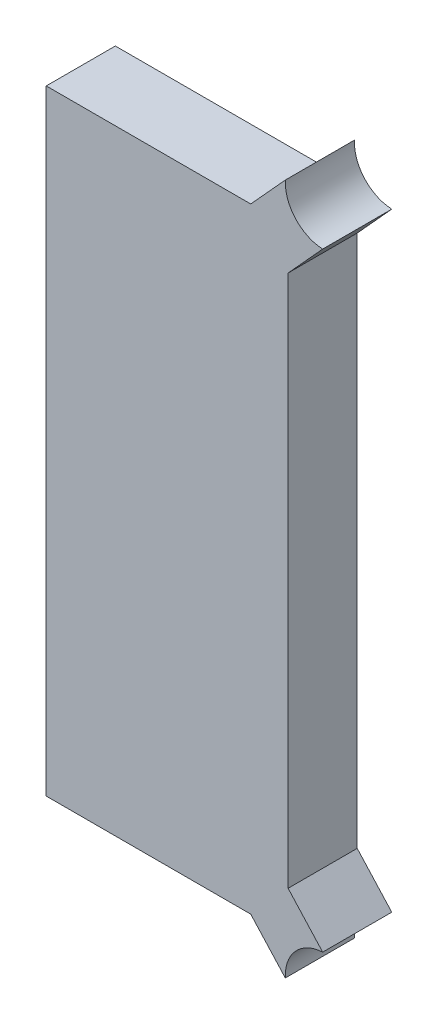
ISO-10303-21;
HEADER;
FILE_DESCRIPTION(('STEP AP214'),'2;1');
FILE_NAME('part.step','',(''),(''),'','','');
FILE_SCHEMA(('AUTOMOTIVE_DESIGN { 1 0 10303 214 1 1 1 1 }'));
ENDSEC;
DATA;
#1=APPLICATION_CONTEXT('core data for automotive mechanical design processes');
#2=APPLICATION_PROTOCOL_DEFINITION('international standard','automotive_design',2000,#1);
#3=PRODUCT_CONTEXT('',#1,'mechanical');
#4=PRODUCT('Part','Part','',(#3));
#5=PRODUCT_RELATED_PRODUCT_CATEGORY('part','',(#4));
#6=PRODUCT_DEFINITION_FORMATION('','',#4);
#7=PRODUCT_DEFINITION_CONTEXT('part definition',#1,'design');
#8=PRODUCT_DEFINITION('design','',#6,#7);
#9=PRODUCT_DEFINITION_SHAPE('','',#8);
#10=(LENGTH_UNIT() NAMED_UNIT(*) SI_UNIT(.MILLI.,.METRE.));
#11=(NAMED_UNIT(*) PLANE_ANGLE_UNIT() SI_UNIT($,.RADIAN.));
#12=(NAMED_UNIT(*) SI_UNIT($,.STERADIAN.) SOLID_ANGLE_UNIT());
#13=UNCERTAINTY_MEASURE_WITH_UNIT(LENGTH_MEASURE(1.E-05),#10,'distance_accuracy_value','');
#14=(GEOMETRIC_REPRESENTATION_CONTEXT(3) GLOBAL_UNCERTAINTY_ASSIGNED_CONTEXT((#13)) GLOBAL_UNIT_ASSIGNED_CONTEXT((#10,
#11,#12)) REPRESENTATION_CONTEXT('',''));
#15=CARTESIAN_POINT('',(0.,0.,0.));
#16=DIRECTION('',(0.,0.,1.));
#17=DIRECTION('',(1.,0.,0.));
#18=AXIS2_PLACEMENT_3D('',#15,#16,#17);
#19=CARTESIAN_POINT('',(0.495941568191569,-0.445,0.));
#20=DIRECTION('',(-0.739940073395943,-0.672672793996313,0.));
#21=DIRECTION('',(0.672672793996313,-0.739940073395943,0.));
#22=AXIS2_PLACEMENT_3D('',#19,#20,#21);
#23=PLANE('',#22);
#24=DIRECTION('',(0.672672793996313,-0.739940073395943,0.));
#25=VECTOR('',#24,1.);
#26=CARTESIAN_POINT('',(0.470402397064162,-0.416906911759853,0.));
#27=LINE('',#26,#25);
#28=CARTESIAN_POINT('',(0.495941568191569,-0.445,0.));
#29=VERTEX_POINT('',#28);
#30=CARTESIAN_POINT('',(0.545941568191569,-0.5,0.));
#31=VERTEX_POINT('',#30);
#32=EDGE_CURVE('E11',#29,#31,#27,.T.);
#33=ORIENTED_EDGE('',*,*,#32,.T.);
#34=DIRECTION('',(0.,0.,1.));
#35=VECTOR('',#34,1.);
#36=CARTESIAN_POINT('',(0.545941568191569,-0.5,0.));
#37=LINE('',#36,#35);
#38=CARTESIAN_POINT('',(0.545941568191569,-0.5,0.1));
#39=VERTEX_POINT('',#38);
#40=EDGE_CURVE('E24',#31,#39,#37,.T.);
#41=ORIENTED_EDGE('',*,*,#40,.T.);
#42=DIRECTION('',(0.672672793996313,-0.739940073395943,0.));
#43=VECTOR('',#42,1.);
#44=CARTESIAN_POINT('',(0.470402397064162,-0.416906911759853,0.1));
#45=LINE('',#44,#43);
#46=CARTESIAN_POINT('',(0.495941568191569,-0.445,0.1));
#47=VERTEX_POINT('',#46);
#48=EDGE_CURVE('E112',#47,#39,#45,.T.);
#49=ORIENTED_EDGE('',*,*,#48,.F.);
#50=DIRECTION('',(0.,0.,1.));
#51=VECTOR('',#50,1.);
#52=CARTESIAN_POINT('',(0.495941568191569,-0.445,0.));
#53=LINE('',#52,#51);
#54=EDGE_CURVE('E175',#29,#47,#53,.T.);
#55=ORIENTED_EDGE('',*,*,#54,.F.);
#56=EDGE_LOOP('',(#33,#41,#49,#55));
#57=FACE_BOUND('',#56,.T.);
#58=ADVANCED_FACE('F17',(#57),#23,.T.);
#59=CARTESIAN_POINT('',(0.2,-0.445,0.));
#60=DIRECTION('',(0.,-1.,0.));
#61=DIRECTION('',(1.,0.,0.));
#62=AXIS2_PLACEMENT_3D('',#59,#60,#61);
#63=PLANE('',#62);
#64=DIRECTION('',(1.,0.,0.));
#65=VECTOR('',#64,1.);
#66=CARTESIAN_POINT('',(0.2,-0.445,0.));
#67=LINE('',#66,#65);
#68=CARTESIAN_POINT('',(0.2,-0.445,0.));
#69=VERTEX_POINT('',#68);
#70=EDGE_CURVE('E172',#69,#29,#67,.T.);
#71=ORIENTED_EDGE('',*,*,#70,.T.);
#72=ORIENTED_EDGE('',*,*,#54,.T.);
#73=DIRECTION('',(1.,0.,0.));
#74=VECTOR('',#73,1.);
#75=CARTESIAN_POINT('',(0.2,-0.445,0.1));
#76=LINE('',#75,#74);
#77=CARTESIAN_POINT('',(0.2,-0.445,0.1));
#78=VERTEX_POINT('',#77);
#79=EDGE_CURVE('E170',#78,#47,#76,.T.);
#80=ORIENTED_EDGE('',*,*,#79,.F.);
#81=DIRECTION('',(0.,0.,1.));
#82=VECTOR('',#81,1.);
#83=CARTESIAN_POINT('',(0.2,-0.445,0.));
#84=LINE('',#83,#82);
#85=EDGE_CURVE('E167',#69,#78,#84,.T.);
#86=ORIENTED_EDGE('',*,*,#85,.F.);
#87=EDGE_LOOP('',(#71,#72,#80,#86));
#88=FACE_BOUND('',#87,.T.);
#89=ADVANCED_FACE('F199',(#88),#63,.T.);
#90=CARTESIAN_POINT('',(0.2,0.445,0.));
#91=DIRECTION('',(-1.,0.,0.));
#92=DIRECTION('',(0.,-1.,0.));
#93=AXIS2_PLACEMENT_3D('',#90,#91,#92);
#94=PLANE('',#93);
#95=DIRECTION('',(0.,-1.,0.));
#96=VECTOR('',#95,1.);
#97=CARTESIAN_POINT('',(0.2,0.445,0.));
#98=LINE('',#97,#96);
#99=CARTESIAN_POINT('',(0.2,0.445,0.));
#100=VERTEX_POINT('',#99);
#101=EDGE_CURVE('E164',#100,#69,#98,.T.);
#102=ORIENTED_EDGE('',*,*,#101,.T.);
#103=ORIENTED_EDGE('',*,*,#85,.T.);
#104=DIRECTION('',(0.,-1.,0.));
#105=VECTOR('',#104,1.);
#106=CARTESIAN_POINT('',(0.2,0.445,0.1));
#107=LINE('',#106,#105);
#108=CARTESIAN_POINT('',(0.2,0.445,0.1));
#109=VERTEX_POINT('',#108);
#110=EDGE_CURVE('E161',#109,#78,#107,.T.);
#111=ORIENTED_EDGE('',*,*,#110,.F.);
#112=DIRECTION('',(0.,0.,1.));
#113=VECTOR('',#112,1.);
#114=CARTESIAN_POINT('',(0.2,0.445,0.));
#115=LINE('',#114,#113);
#116=EDGE_CURVE('E158',#100,#109,#115,.T.);
#117=ORIENTED_EDGE('',*,*,#116,.F.);
#118=EDGE_LOOP('',(#102,#103,#111,#117));
#119=FACE_BOUND('',#118,.T.);
#120=ADVANCED_FACE('F196',(#119),#94,.T.);
#121=CARTESIAN_POINT('',(0.495941568191569,0.445,0.));
#122=DIRECTION('',(0.,1.,0.));
#123=DIRECTION('',(-1.,0.,0.));
#124=AXIS2_PLACEMENT_3D('',#121,#122,#123);
#125=PLANE('',#124);
#126=DIRECTION('',(-1.,0.,0.));
#127=VECTOR('',#126,1.);
#128=CARTESIAN_POINT('',(0.55,0.445,0.));
#129=LINE('',#128,#127);
#130=CARTESIAN_POINT('',(0.495941568191569,0.445,0.));
#131=VERTEX_POINT('',#130);
#132=EDGE_CURVE('E155',#131,#100,#129,.T.);
#133=ORIENTED_EDGE('',*,*,#132,.T.);
#134=ORIENTED_EDGE('',*,*,#116,.T.);
#135=DIRECTION('',(-1.,0.,0.));
#136=VECTOR('',#135,1.);
#137=CARTESIAN_POINT('',(0.55,0.445,0.1));
#138=LINE('',#137,#136);
#139=CARTESIAN_POINT('',(0.495941568191569,0.445,0.1));
#140=VERTEX_POINT('',#139);
#141=EDGE_CURVE('E152',#140,#109,#138,.T.);
#142=ORIENTED_EDGE('',*,*,#141,.F.);
#143=DIRECTION('',(0.,0.,1.));
#144=VECTOR('',#143,1.);
#145=CARTESIAN_POINT('',(0.495941568191569,0.445,0.));
#146=LINE('',#145,#144);
#147=EDGE_CURVE('E149',#131,#140,#146,.T.);
#148=ORIENTED_EDGE('',*,*,#147,.F.);
#149=EDGE_LOOP('',(#133,#134,#142,#148));
#150=FACE_BOUND('',#149,.T.);
#151=ADVANCED_FACE('F193',(#150),#125,.T.);
#152=CARTESIAN_POINT('',(0.545941568191569,0.5,0.));
#153=DIRECTION('',(-0.739940073395943,0.672672793996313,0.));
#154=DIRECTION('',(-0.672672793996313,-0.739940073395943,0.));
#155=AXIS2_PLACEMENT_3D('',#152,#153,#154);
#156=PLANE('',#155);
#157=DIRECTION('',(-0.672672793996313,-0.739940073395943,0.));
#158=VECTOR('',#157,1.);
#159=CARTESIAN_POINT('',(0.545941568191569,0.5,0.));
#160=LINE('',#159,#158);
#161=CARTESIAN_POINT('',(0.545941568191569,0.5,0.));
#162=VERTEX_POINT('',#161);
#163=EDGE_CURVE('E146',#162,#131,#160,.T.);
#164=ORIENTED_EDGE('',*,*,#163,.T.);
#165=ORIENTED_EDGE('',*,*,#147,.T.);
#166=DIRECTION('',(-0.672672793996313,-0.739940073395943,0.));
#167=VECTOR('',#166,1.);
#168=CARTESIAN_POINT('',(0.545941568191569,0.5,0.1));
#169=LINE('',#168,#167);
#170=CARTESIAN_POINT('',(0.545941568191569,0.5,0.1));
#171=VERTEX_POINT('',#170);
#172=EDGE_CURVE('E143',#171,#140,#169,.T.);
#173=ORIENTED_EDGE('',*,*,#172,.F.);
#174=DIRECTION('',(0.,0.,1.));
#175=VECTOR('',#174,1.);
#176=CARTESIAN_POINT('',(0.545941568191569,0.5,0.));
#177=LINE('',#176,#175);
#178=EDGE_CURVE('E140',#162,#171,#177,.T.);
#179=ORIENTED_EDGE('',*,*,#178,.F.);
#180=EDGE_LOOP('',(#164,#165,#173,#179));
#181=FACE_BOUND('',#180,.T.);
#182=ADVANCED_FACE('F190',(#181),#156,.T.);
#183=CARTESIAN_POINT('',(0.602707086608445,0.4973008647896,0.));
#184=DIRECTION('',(0.,0.,1.));
#185=DIRECTION('',(0.998871466616461,-0.04749519111952,0.));
#186=AXIS2_PLACEMENT_3D('',#183,#184,#185);
#187=CYLINDRICAL_SURFACE('',#186,0.0568296525769845);
#188=CARTESIAN_POINT('',(0.602707086608445,0.4973008647896,0.));
#189=DIRECTION('',(0.,0.,-1.));
#190=DIRECTION('',(0.998871466616461,-0.04749519111952,0.));
#191=AXIS2_PLACEMENT_3D('',#188,#189,#190);
#192=CIRCLE('',#191,0.0568296525769845);
#193=CARTESIAN_POINT('',(0.6,0.440535725010726,0.));
#194=VERTEX_POINT('',#193);
#195=EDGE_CURVE('E137',#194,#162,#192,.T.);
#196=ORIENTED_EDGE('',*,*,#195,.T.);
#197=ORIENTED_EDGE('',*,*,#178,.T.);
#198=CARTESIAN_POINT('',(0.602707086608445,0.4973008647896,0.1));
#199=DIRECTION('',(0.,0.,-1.));
#200=DIRECTION('',(0.998871466616461,-0.04749519111952,0.));
#201=AXIS2_PLACEMENT_3D('',#198,#199,#200);
#202=CIRCLE('',#201,0.0568296525769845);
#203=CARTESIAN_POINT('',(0.6,0.440535725010726,0.1));
#204=VERTEX_POINT('',#203);
#205=EDGE_CURVE('E134',#204,#171,#202,.T.);
#206=ORIENTED_EDGE('',*,*,#205,.F.);
#207=DIRECTION('',(0.,0.,1.));
#208=VECTOR('',#207,1.);
#209=CARTESIAN_POINT('',(0.6,0.440535725010726,0.));
#210=LINE('',#209,#208);
#211=EDGE_CURVE('E132',#194,#204,#210,.T.);
#212=ORIENTED_EDGE('',*,*,#211,.F.);
#213=EDGE_LOOP('',(#196,#197,#206,#212));
#214=FACE_BOUND('',#213,.T.);
#215=ADVANCED_FACE('F187',(#214),#187,.F.);
#216=CARTESIAN_POINT('',(0.55,0.385535725010726,0.));
#217=DIRECTION('',(0.739940073395944,-0.672672793996312,0.));
#218=DIRECTION('',(0.672672793996312,0.739940073395944,0.));
#219=AXIS2_PLACEMENT_3D('',#216,#217,#218);
#220=PLANE('',#219);
#221=DIRECTION('',(0.672672793996312,0.739940073395944,0.));
#222=VECTOR('',#221,1.);
#223=CARTESIAN_POINT('',(0.529597602935838,0.363093088240148,0.));
#224=LINE('',#223,#222);
#225=CARTESIAN_POINT('',(0.55,0.385535725010726,0.));
#226=VERTEX_POINT('',#225);
#227=EDGE_CURVE('E129',#226,#194,#224,.T.);
#228=ORIENTED_EDGE('',*,*,#227,.T.);
#229=ORIENTED_EDGE('',*,*,#211,.T.);
#230=DIRECTION('',(0.672672793996312,0.739940073395944,0.));
#231=VECTOR('',#230,1.);
#232=CARTESIAN_POINT('',(0.529597602935838,0.363093088240148,0.1));
#233=LINE('',#232,#231);
#234=CARTESIAN_POINT('',(0.55,0.385535725010726,0.1));
#235=VERTEX_POINT('',#234);
#236=EDGE_CURVE('E126',#235,#204,#233,.T.);
#237=ORIENTED_EDGE('',*,*,#236,.F.);
#238=DIRECTION('',(0.,0.,1.));
#239=VECTOR('',#238,1.);
#240=CARTESIAN_POINT('',(0.55,0.385535725010726,0.));
#241=LINE('',#240,#239);
#242=EDGE_CURVE('E123',#226,#235,#241,.T.);
#243=ORIENTED_EDGE('',*,*,#242,.F.);
#244=EDGE_LOOP('',(#228,#229,#237,#243));
#245=FACE_BOUND('',#244,.T.);
#246=ADVANCED_FACE('F185',(#245),#220,.T.);
#247=CARTESIAN_POINT('',(0.55,-0.385535725010726,0.));
#248=DIRECTION('',(1.,0.,0.));
#249=DIRECTION('',(0.,1.,0.));
#250=AXIS2_PLACEMENT_3D('',#247,#248,#249);
#251=PLANE('',#250);
#252=DIRECTION('',(0.,1.,0.));
#253=VECTOR('',#252,1.);
#254=CARTESIAN_POINT('',(0.55,-0.445,0.));
#255=LINE('',#254,#253);
#256=CARTESIAN_POINT('',(0.55,-0.385535725010726,0.));
#257=VERTEX_POINT('',#256);
#258=EDGE_CURVE('E120',#257,#226,#255,.T.);
#259=ORIENTED_EDGE('',*,*,#258,.T.);
#260=ORIENTED_EDGE('',*,*,#242,.T.);
#261=DIRECTION('',(0.,1.,0.));
#262=VECTOR('',#261,1.);
#263=CARTESIAN_POINT('',(0.55,-0.445,0.1));
#264=LINE('',#263,#262);
#265=CARTESIAN_POINT('',(0.55,-0.385535725010726,0.1));
#266=VERTEX_POINT('',#265);
#267=EDGE_CURVE('E118',#266,#235,#264,.T.);
#268=ORIENTED_EDGE('',*,*,#267,.F.);
#269=DIRECTION('',(0.,0.,1.));
#270=VECTOR('',#269,1.);
#271=CARTESIAN_POINT('',(0.55,-0.385535725010726,0.));
#272=LINE('',#271,#270);
#273=EDGE_CURVE('E97',#257,#266,#272,.T.);
#274=ORIENTED_EDGE('',*,*,#273,.F.);
#275=EDGE_LOOP('',(#259,#260,#268,#274));
#276=FACE_BOUND('',#275,.T.);
#277=ADVANCED_FACE('F182',(#276),#251,.T.);
#278=CARTESIAN_POINT('',(0.6,-0.440535725010726,0.));
#279=DIRECTION('',(0.739940073395944,0.672672793996312,0.));
#280=DIRECTION('',(-0.672672793996312,0.739940073395944,0.));
#281=AXIS2_PLACEMENT_3D('',#278,#279,#280);
#282=PLANE('',#281);
#283=DIRECTION('',(-0.672672793996312,0.739940073395944,0.));
#284=VECTOR('',#283,1.);
#285=CARTESIAN_POINT('',(0.6,-0.440535725010726,0.));
#286=LINE('',#285,#284);
#287=CARTESIAN_POINT('',(0.6,-0.440535725010726,0.));
#288=VERTEX_POINT('',#287);
#289=EDGE_CURVE('E101',#288,#257,#286,.T.);
#290=ORIENTED_EDGE('',*,*,#289,.T.);
#291=ORIENTED_EDGE('',*,*,#273,.T.);
#292=DIRECTION('',(-0.672672793996312,0.739940073395944,0.));
#293=VECTOR('',#292,1.);
#294=CARTESIAN_POINT('',(0.6,-0.440535725010726,0.1));
#295=LINE('',#294,#293);
#296=CARTESIAN_POINT('',(0.6,-0.440535725010726,0.1));
#297=VERTEX_POINT('',#296);
#298=EDGE_CURVE('E90',#297,#266,#295,.T.);
#299=ORIENTED_EDGE('',*,*,#298,.F.);
#300=DIRECTION('',(0.,0.,1.));
#301=VECTOR('',#300,1.);
#302=CARTESIAN_POINT('',(0.6,-0.440535725010726,0.));
#303=LINE('',#302,#301);
#304=EDGE_CURVE('E94',#288,#297,#303,.T.);
#305=ORIENTED_EDGE('',*,*,#304,.F.);
#306=EDGE_LOOP('',(#290,#291,#299,#305));
#307=FACE_BOUND('',#306,.T.);
#308=ADVANCED_FACE('F93',(#307),#282,.T.);
#309=CARTESIAN_POINT('',(0.602707086608445,-0.4973008647896,0.));
#310=DIRECTION('',(0.,0.,1.));
#311=DIRECTION('',(0.047635107478059,-0.998864803932721,0.));
#312=AXIS2_PLACEMENT_3D('',#309,#310,#311);
#313=CYLINDRICAL_SURFACE('',#312,0.0568296525769845);
#314=CARTESIAN_POINT('',(0.602707086608445,-0.4973008647896,0.));
#315=DIRECTION('',(0.,0.,-1.));
#316=DIRECTION('',(0.047635107478059,-0.998864803932721,0.));
#317=AXIS2_PLACEMENT_3D('',#314,#315,#316);
#318=CIRCLE('',#317,0.0568296525769845);
#319=EDGE_CURVE('E107',#31,#288,#318,.T.);
#320=ORIENTED_EDGE('',*,*,#319,.T.);
#321=ORIENTED_EDGE('',*,*,#304,.T.);
#322=CARTESIAN_POINT('',(0.602707086608445,-0.4973008647896,0.1));
#323=DIRECTION('',(0.,0.,-1.));
#324=DIRECTION('',(0.047635107478059,-0.998864803932721,0.));
#325=AXIS2_PLACEMENT_3D('',#322,#323,#324);
#326=CIRCLE('',#325,0.0568296525769845);
#327=EDGE_CURVE('E106',#39,#297,#326,.T.);
#328=ORIENTED_EDGE('',*,*,#327,.F.);
#329=ORIENTED_EDGE('',*,*,#40,.F.);
#330=EDGE_LOOP('',(#320,#321,#328,#329));
#331=FACE_BOUND('',#330,.T.);
#332=ADVANCED_FACE('F105',(#331),#313,.F.);
#333=CARTESIAN_POINT('',(0.4,0.,0.1));
#334=DIRECTION('',(0.,0.,1.));
#335=DIRECTION('',(1.,0.,0.));
#336=AXIS2_PLACEMENT_3D('',#333,#334,#335);
#337=PLANE('',#336);
#338=ORIENTED_EDGE('',*,*,#327,.T.);
#339=ORIENTED_EDGE('',*,*,#298,.T.);
#340=ORIENTED_EDGE('',*,*,#267,.T.);
#341=ORIENTED_EDGE('',*,*,#236,.T.);
#342=ORIENTED_EDGE('',*,*,#205,.T.);
#343=ORIENTED_EDGE('',*,*,#172,.T.);
#344=ORIENTED_EDGE('',*,*,#141,.T.);
#345=ORIENTED_EDGE('',*,*,#110,.T.);
#346=ORIENTED_EDGE('',*,*,#79,.T.);
#347=ORIENTED_EDGE('',*,*,#48,.T.);
#348=EDGE_LOOP('',(#338,#339,#340,#341,#342,#343,#344,#345,#346,#347));
#349=FACE_BOUND('',#348,.T.);
#350=ADVANCED_FACE('F110',(#349),#337,.T.);
#351=CARTESIAN_POINT('',(0.4,0.,0.));
#352=DIRECTION('',(0.,0.,1.));
#353=DIRECTION('',(1.,0.,0.));
#354=AXIS2_PLACEMENT_3D('',#351,#352,#353);
#355=PLANE('',#354);
#356=ORIENTED_EDGE('',*,*,#319,.F.);
#357=ORIENTED_EDGE('',*,*,#32,.F.);
#358=ORIENTED_EDGE('',*,*,#70,.F.);
#359=ORIENTED_EDGE('',*,*,#101,.F.);
#360=ORIENTED_EDGE('',*,*,#132,.F.);
#361=ORIENTED_EDGE('',*,*,#163,.F.);
#362=ORIENTED_EDGE('',*,*,#195,.F.);
#363=ORIENTED_EDGE('',*,*,#227,.F.);
#364=ORIENTED_EDGE('',*,*,#258,.F.);
#365=ORIENTED_EDGE('',*,*,#289,.F.);
#366=EDGE_LOOP('',(#356,#357,#358,#359,#360,#361,#362,#363,#364,#365));
#367=FACE_BOUND('',#366,.T.);
#368=ADVANCED_FACE('F178',(#367),#355,.F.);
#369=CLOSED_SHELL('',(#58,#89,#120,#151,#182,#215,#246,#277,#308,#332,#350,#368));
#370=MANIFOLD_SOLID_BREP('B1',#369);
#371=ADVANCED_BREP_SHAPE_REPRESENTATION('',(#18,#370),#14);
#372=SHAPE_DEFINITION_REPRESENTATION(#9,#371);
ENDSEC;
END-ISO-10303-21;
